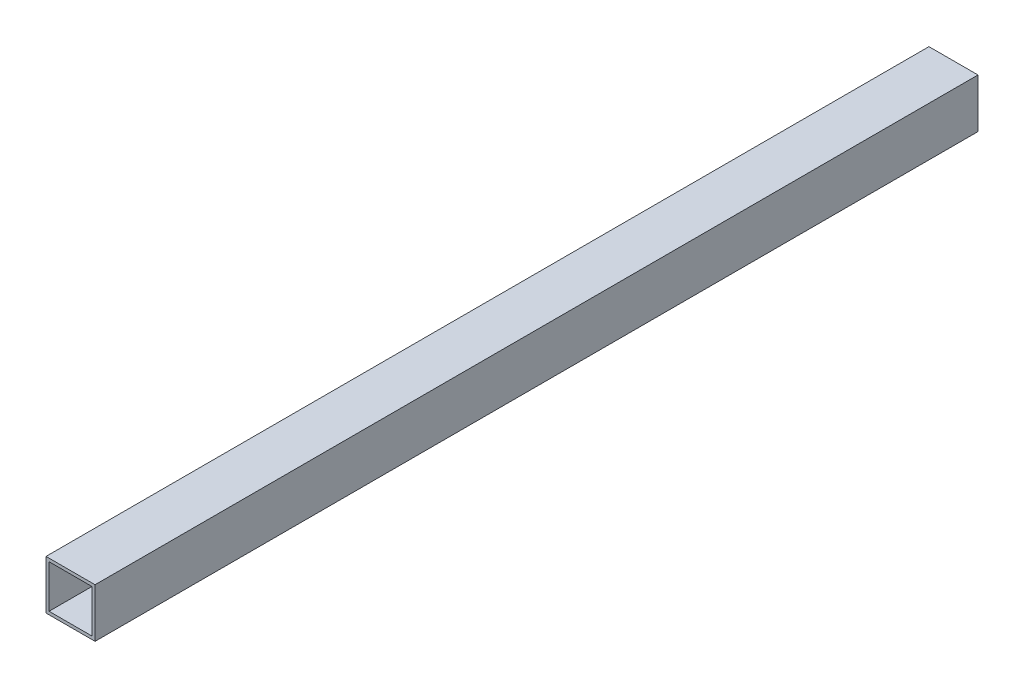
ISO-10303-21;
HEADER;
FILE_DESCRIPTION(('STEP AP214'),'2;1');
FILE_NAME('part.step','',(''),(''),'','','');
FILE_SCHEMA(('AUTOMOTIVE_DESIGN { 1 0 10303 214 1 1 1 1 }'));
ENDSEC;
DATA;
#1=APPLICATION_CONTEXT('core data for automotive mechanical design processes');
#2=APPLICATION_PROTOCOL_DEFINITION('international standard','automotive_design',2000,#1);
#3=PRODUCT_CONTEXT('',#1,'mechanical');
#4=PRODUCT('Part','Part','',(#3));
#5=PRODUCT_RELATED_PRODUCT_CATEGORY('part','',(#4));
#6=PRODUCT_DEFINITION_FORMATION('','',#4);
#7=PRODUCT_DEFINITION_CONTEXT('part definition',#1,'design');
#8=PRODUCT_DEFINITION('design','',#6,#7);
#9=PRODUCT_DEFINITION_SHAPE('','',#8);
#10=(LENGTH_UNIT() NAMED_UNIT(*) SI_UNIT(.MILLI.,.METRE.));
#11=(NAMED_UNIT(*) PLANE_ANGLE_UNIT() SI_UNIT($,.RADIAN.));
#12=(NAMED_UNIT(*) SI_UNIT($,.STERADIAN.) SOLID_ANGLE_UNIT());
#13=UNCERTAINTY_MEASURE_WITH_UNIT(LENGTH_MEASURE(1.E-05),#10,'distance_accuracy_value','');
#14=(GEOMETRIC_REPRESENTATION_CONTEXT(3) GLOBAL_UNCERTAINTY_ASSIGNED_CONTEXT((#13)) GLOBAL_UNIT_ASSIGNED_CONTEXT((#10,
#11,#12)) REPRESENTATION_CONTEXT('',''));
#15=CARTESIAN_POINT('',(0.,0.,0.));
#16=DIRECTION('',(0.,0.,1.));
#17=DIRECTION('',(1.,0.,0.));
#18=AXIS2_PLACEMENT_3D('',#15,#16,#17);
#19=CARTESIAN_POINT('',(0.,0.,914.4));
#20=DIRECTION('',(0.,0.,-1.));
#21=DIRECTION('',(-1.,0.,0.));
#22=AXIS2_PLACEMENT_3D('',#19,#20,#21);
#23=PLANE('',#22);
#24=DIRECTION('',(0.,1.,0.));
#25=VECTOR('',#24,1.);
#26=CARTESIAN_POINT('',(25.4,-25.4,914.4));
#27=LINE('',#26,#25);
#28=CARTESIAN_POINT('',(25.4,-25.4,914.4));
#29=VERTEX_POINT('',#28);
#30=CARTESIAN_POINT('',(25.4,25.4,914.4));
#31=VERTEX_POINT('',#30);
#32=EDGE_CURVE('E134',#29,#31,#27,.T.);
#33=ORIENTED_EDGE('',*,*,#32,.T.);
#34=DIRECTION('',(-1.,0.,0.));
#35=VECTOR('',#34,1.);
#36=CARTESIAN_POINT('',(-25.4,25.4,914.4));
#37=LINE('',#36,#35);
#38=CARTESIAN_POINT('',(-25.4,25.4,914.4));
#39=VERTEX_POINT('',#38);
#40=EDGE_CURVE('E137',#31,#39,#37,.T.);
#41=ORIENTED_EDGE('',*,*,#40,.T.);
#42=DIRECTION('',(0.,-1.,0.));
#43=VECTOR('',#42,1.);
#44=CARTESIAN_POINT('',(-25.4,-25.4,914.4));
#45=LINE('',#44,#43);
#46=CARTESIAN_POINT('',(-25.4,-25.4,914.4));
#47=VERTEX_POINT('',#46);
#48=EDGE_CURVE('E140',#39,#47,#45,.T.);
#49=ORIENTED_EDGE('',*,*,#48,.T.);
#50=DIRECTION('',(1.,0.,0.));
#51=VECTOR('',#50,1.);
#52=CARTESIAN_POINT('',(-25.4,-25.4,914.4));
#53=LINE('',#52,#51);
#54=EDGE_CURVE('E142',#47,#29,#53,.T.);
#55=ORIENTED_EDGE('',*,*,#54,.T.);
#56=EDGE_LOOP('',(#33,#41,#49,#55));
#57=FACE_BOUND('',#56,.T.);
#58=DIRECTION('',(0.,1.,0.));
#59=VECTOR('',#58,1.);
#60=CARTESIAN_POINT('',(22.225,-22.225,914.4));
#61=LINE('',#60,#59);
#62=CARTESIAN_POINT('',(22.225,-22.225,914.4));
#63=VERTEX_POINT('',#62);
#64=CARTESIAN_POINT('',(22.225,22.225,914.4));
#65=VERTEX_POINT('',#64);
#66=EDGE_CURVE('E98',#63,#65,#61,.T.);
#67=ORIENTED_EDGE('',*,*,#66,.F.);
#68=DIRECTION('',(1.,0.,0.));
#69=VECTOR('',#68,1.);
#70=CARTESIAN_POINT('',(-22.225,-22.225,914.4));
#71=LINE('',#70,#69);
#72=CARTESIAN_POINT('',(-22.225,-22.225,914.4));
#73=VERTEX_POINT('',#72);
#74=EDGE_CURVE('E120',#73,#63,#71,.T.);
#75=ORIENTED_EDGE('',*,*,#74,.F.);
#76=DIRECTION('',(0.,-1.,0.));
#77=VECTOR('',#76,1.);
#78=CARTESIAN_POINT('',(-22.225,-22.225,914.4));
#79=LINE('',#78,#77);
#80=CARTESIAN_POINT('',(-22.225,22.225,914.4));
#81=VERTEX_POINT('',#80);
#82=EDGE_CURVE('E118',#81,#73,#79,.T.);
#83=ORIENTED_EDGE('',*,*,#82,.F.);
#84=DIRECTION('',(-1.,0.,0.));
#85=VECTOR('',#84,1.);
#86=CARTESIAN_POINT('',(-22.225,22.225,914.4));
#87=LINE('',#86,#85);
#88=EDGE_CURVE('E106',#65,#81,#87,.T.);
#89=ORIENTED_EDGE('',*,*,#88,.F.);
#90=EDGE_LOOP('',(#67,#75,#83,#89));
#91=FACE_BOUND('',#90,.T.);
#92=ADVANCED_FACE('F33',(#57,#91),#23,.F.);
#93=CARTESIAN_POINT('',(0.,0.,0.));
#94=DIRECTION('',(0.,0.,-1.));
#95=DIRECTION('',(-1.,0.,0.));
#96=AXIS2_PLACEMENT_3D('',#93,#94,#95);
#97=PLANE('',#96);
#98=DIRECTION('',(0.,1.,0.));
#99=VECTOR('',#98,1.);
#100=CARTESIAN_POINT('',(25.4,-25.4,0.));
#101=LINE('',#100,#99);
#102=CARTESIAN_POINT('',(25.4,-25.4,0.));
#103=VERTEX_POINT('',#102);
#104=CARTESIAN_POINT('',(25.4,25.4,0.));
#105=VERTEX_POINT('',#104);
#106=EDGE_CURVE('E114',#103,#105,#101,.T.);
#107=ORIENTED_EDGE('',*,*,#106,.F.);
#108=DIRECTION('',(1.,0.,0.));
#109=VECTOR('',#108,1.);
#110=CARTESIAN_POINT('',(-25.4,-25.4,0.));
#111=LINE('',#110,#109);
#112=CARTESIAN_POINT('',(-25.4,-25.4,0.));
#113=VERTEX_POINT('',#112);
#114=EDGE_CURVE('E138',#113,#103,#111,.T.);
#115=ORIENTED_EDGE('',*,*,#114,.F.);
#116=DIRECTION('',(0.,-1.,0.));
#117=VECTOR('',#116,1.);
#118=CARTESIAN_POINT('',(-25.4,-25.4,0.));
#119=LINE('',#118,#117);
#120=CARTESIAN_POINT('',(-25.4,25.4,0.));
#121=VERTEX_POINT('',#120);
#122=EDGE_CURVE('E149',#121,#113,#119,.T.);
#123=ORIENTED_EDGE('',*,*,#122,.F.);
#124=DIRECTION('',(-1.,0.,0.));
#125=VECTOR('',#124,1.);
#126=CARTESIAN_POINT('',(-25.4,25.4,0.));
#127=LINE('',#126,#125);
#128=EDGE_CURVE('E147',#105,#121,#127,.T.);
#129=ORIENTED_EDGE('',*,*,#128,.F.);
#130=EDGE_LOOP('',(#107,#115,#123,#129));
#131=FACE_BOUND('',#130,.T.);
#132=DIRECTION('',(1.,0.,0.));
#133=VECTOR('',#132,1.);
#134=CARTESIAN_POINT('',(-22.225,-22.225,0.));
#135=LINE('',#134,#133);
#136=CARTESIAN_POINT('',(-22.225,-22.225,0.));
#137=VERTEX_POINT('',#136);
#138=CARTESIAN_POINT('',(22.225,-22.225,0.));
#139=VERTEX_POINT('',#138);
#140=EDGE_CURVE('E107',#137,#139,#135,.T.);
#141=ORIENTED_EDGE('',*,*,#140,.T.);
#142=DIRECTION('',(0.,1.,0.));
#143=VECTOR('',#142,1.);
#144=CARTESIAN_POINT('',(22.225,-22.225,0.));
#145=LINE('',#144,#143);
#146=CARTESIAN_POINT('',(22.225,22.225,0.));
#147=VERTEX_POINT('',#146);
#148=EDGE_CURVE('E56',#139,#147,#145,.T.);
#149=ORIENTED_EDGE('',*,*,#148,.T.);
#150=DIRECTION('',(-1.,0.,0.));
#151=VECTOR('',#150,1.);
#152=CARTESIAN_POINT('',(-22.225,22.225,0.));
#153=LINE('',#152,#151);
#154=CARTESIAN_POINT('',(-22.225,22.225,0.));
#155=VERTEX_POINT('',#154);
#156=EDGE_CURVE('E113',#147,#155,#153,.T.);
#157=ORIENTED_EDGE('',*,*,#156,.T.);
#158=DIRECTION('',(0.,-1.,0.));
#159=VECTOR('',#158,1.);
#160=CARTESIAN_POINT('',(-22.225,-22.225,0.));
#161=LINE('',#160,#159);
#162=EDGE_CURVE('E126',#155,#137,#161,.T.);
#163=ORIENTED_EDGE('',*,*,#162,.T.);
#164=EDGE_LOOP('',(#141,#149,#157,#163));
#165=FACE_BOUND('',#164,.T.);
#166=ADVANCED_FACE('F167',(#131,#165),#97,.T.);
#167=CARTESIAN_POINT('',(25.4,-25.4,914.4));
#168=DIRECTION('',(-1.,0.,0.));
#169=DIRECTION('',(0.,0.,1.));
#170=AXIS2_PLACEMENT_3D('',#167,#168,#169);
#171=PLANE('',#170);
#172=ORIENTED_EDGE('',*,*,#106,.T.);
#173=DIRECTION('',(0.,0.,-1.));
#174=VECTOR('',#173,1.);
#175=CARTESIAN_POINT('',(25.4,25.4,914.4));
#176=LINE('',#175,#174);
#177=EDGE_CURVE('E11',#31,#105,#176,.T.);
#178=ORIENTED_EDGE('',*,*,#177,.F.);
#179=ORIENTED_EDGE('',*,*,#32,.F.);
#180=DIRECTION('',(0.,0.,-1.));
#181=VECTOR('',#180,1.);
#182=CARTESIAN_POINT('',(25.4,-25.4,914.4));
#183=LINE('',#182,#181);
#184=EDGE_CURVE('E144',#29,#103,#183,.T.);
#185=ORIENTED_EDGE('',*,*,#184,.T.);
#186=EDGE_LOOP('',(#172,#178,#179,#185));
#187=FACE_BOUND('',#186,.T.);
#188=ADVANCED_FACE('F35',(#187),#171,.F.);
#189=CARTESIAN_POINT('',(-25.4,25.4,914.4));
#190=DIRECTION('',(0.,-1.,0.));
#191=DIRECTION('',(0.,0.,-1.));
#192=AXIS2_PLACEMENT_3D('',#189,#190,#191);
#193=PLANE('',#192);
#194=ORIENTED_EDGE('',*,*,#128,.T.);
#195=DIRECTION('',(0.,0.,-1.));
#196=VECTOR('',#195,1.);
#197=CARTESIAN_POINT('',(-25.4,25.4,914.4));
#198=LINE('',#197,#196);
#199=EDGE_CURVE('E41',#39,#121,#198,.T.);
#200=ORIENTED_EDGE('',*,*,#199,.F.);
#201=ORIENTED_EDGE('',*,*,#40,.F.);
#202=ORIENTED_EDGE('',*,*,#177,.T.);
#203=EDGE_LOOP('',(#194,#200,#201,#202));
#204=FACE_BOUND('',#203,.T.);
#205=ADVANCED_FACE('F177',(#204),#193,.F.);
#206=CARTESIAN_POINT('',(-25.4,-25.4,914.4));
#207=DIRECTION('',(1.,0.,0.));
#208=DIRECTION('',(0.,0.,-1.));
#209=AXIS2_PLACEMENT_3D('',#206,#207,#208);
#210=PLANE('',#209);
#211=ORIENTED_EDGE('',*,*,#122,.T.);
#212=DIRECTION('',(0.,0.,-1.));
#213=VECTOR('',#212,1.);
#214=CARTESIAN_POINT('',(-25.4,-25.4,914.4));
#215=LINE('',#214,#213);
#216=EDGE_CURVE('E154',#47,#113,#215,.T.);
#217=ORIENTED_EDGE('',*,*,#216,.F.);
#218=ORIENTED_EDGE('',*,*,#48,.F.);
#219=ORIENTED_EDGE('',*,*,#199,.T.);
#220=EDGE_LOOP('',(#211,#217,#218,#219));
#221=FACE_BOUND('',#220,.T.);
#222=ADVANCED_FACE('F161',(#221),#210,.F.);
#223=CARTESIAN_POINT('',(-25.4,-25.4,914.4));
#224=DIRECTION('',(0.,1.,0.));
#225=DIRECTION('',(0.,0.,1.));
#226=AXIS2_PLACEMENT_3D('',#223,#224,#225);
#227=PLANE('',#226);
#228=ORIENTED_EDGE('',*,*,#114,.T.);
#229=ORIENTED_EDGE('',*,*,#184,.F.);
#230=ORIENTED_EDGE('',*,*,#54,.F.);
#231=ORIENTED_EDGE('',*,*,#216,.T.);
#232=EDGE_LOOP('',(#228,#229,#230,#231));
#233=FACE_BOUND('',#232,.T.);
#234=ADVANCED_FACE('F171',(#233),#227,.F.);
#235=CARTESIAN_POINT('',(22.225,-22.225,914.4));
#236=DIRECTION('',(-1.,0.,0.));
#237=DIRECTION('',(0.,0.,1.));
#238=AXIS2_PLACEMENT_3D('',#235,#236,#237);
#239=PLANE('',#238);
#240=ORIENTED_EDGE('',*,*,#148,.F.);
#241=DIRECTION('',(0.,0.,-1.));
#242=VECTOR('',#241,1.);
#243=CARTESIAN_POINT('',(22.225,-22.225,914.4));
#244=LINE('',#243,#242);
#245=EDGE_CURVE('E102',#63,#139,#244,.T.);
#246=ORIENTED_EDGE('',*,*,#245,.F.);
#247=ORIENTED_EDGE('',*,*,#66,.T.);
#248=DIRECTION('',(0.,0.,-1.));
#249=VECTOR('',#248,1.);
#250=CARTESIAN_POINT('',(22.225,22.225,914.4));
#251=LINE('',#250,#249);
#252=EDGE_CURVE('E101',#65,#147,#251,.T.);
#253=ORIENTED_EDGE('',*,*,#252,.T.);
#254=EDGE_LOOP('',(#240,#246,#247,#253));
#255=FACE_BOUND('',#254,.T.);
#256=ADVANCED_FACE('F100',(#255),#239,.T.);
#257=CARTESIAN_POINT('',(-22.225,22.225,914.4));
#258=DIRECTION('',(0.,-1.,0.));
#259=DIRECTION('',(0.,0.,-1.));
#260=AXIS2_PLACEMENT_3D('',#257,#258,#259);
#261=PLANE('',#260);
#262=ORIENTED_EDGE('',*,*,#156,.F.);
#263=ORIENTED_EDGE('',*,*,#252,.F.);
#264=ORIENTED_EDGE('',*,*,#88,.T.);
#265=DIRECTION('',(0.,0.,-1.));
#266=VECTOR('',#265,1.);
#267=CARTESIAN_POINT('',(-22.225,22.225,914.4));
#268=LINE('',#267,#266);
#269=EDGE_CURVE('E115',#81,#155,#268,.T.);
#270=ORIENTED_EDGE('',*,*,#269,.T.);
#271=EDGE_LOOP('',(#262,#263,#264,#270));
#272=FACE_BOUND('',#271,.T.);
#273=ADVANCED_FACE('F110',(#272),#261,.T.);
#274=CARTESIAN_POINT('',(-22.225,-22.225,914.4));
#275=DIRECTION('',(1.,0.,0.));
#276=DIRECTION('',(0.,0.,-1.));
#277=AXIS2_PLACEMENT_3D('',#274,#275,#276);
#278=PLANE('',#277);
#279=ORIENTED_EDGE('',*,*,#162,.F.);
#280=ORIENTED_EDGE('',*,*,#269,.F.);
#281=ORIENTED_EDGE('',*,*,#82,.T.);
#282=DIRECTION('',(0.,0.,-1.));
#283=VECTOR('',#282,1.);
#284=CARTESIAN_POINT('',(-22.225,-22.225,914.4));
#285=LINE('',#284,#283);
#286=EDGE_CURVE('E48',#73,#137,#285,.T.);
#287=ORIENTED_EDGE('',*,*,#286,.T.);
#288=EDGE_LOOP('',(#279,#280,#281,#287));
#289=FACE_BOUND('',#288,.T.);
#290=ADVANCED_FACE('F200',(#289),#278,.T.);
#291=CARTESIAN_POINT('',(-22.225,-22.225,914.4));
#292=DIRECTION('',(0.,1.,0.));
#293=DIRECTION('',(0.,0.,1.));
#294=AXIS2_PLACEMENT_3D('',#291,#292,#293);
#295=PLANE('',#294);
#296=ORIENTED_EDGE('',*,*,#140,.F.);
#297=ORIENTED_EDGE('',*,*,#286,.F.);
#298=ORIENTED_EDGE('',*,*,#74,.T.);
#299=ORIENTED_EDGE('',*,*,#245,.T.);
#300=EDGE_LOOP('',(#296,#297,#298,#299));
#301=FACE_BOUND('',#300,.T.);
#302=ADVANCED_FACE('F204',(#301),#295,.T.);
#303=CLOSED_SHELL('',(#92,#166,#188,#205,#222,#234,#256,#273,#290,#302));
#304=MANIFOLD_SOLID_BREP('B2',#303);
#305=ADVANCED_BREP_SHAPE_REPRESENTATION('',(#18,#304),#14);
#306=SHAPE_DEFINITION_REPRESENTATION(#9,#305);
ENDSEC;
END-ISO-10303-21;
